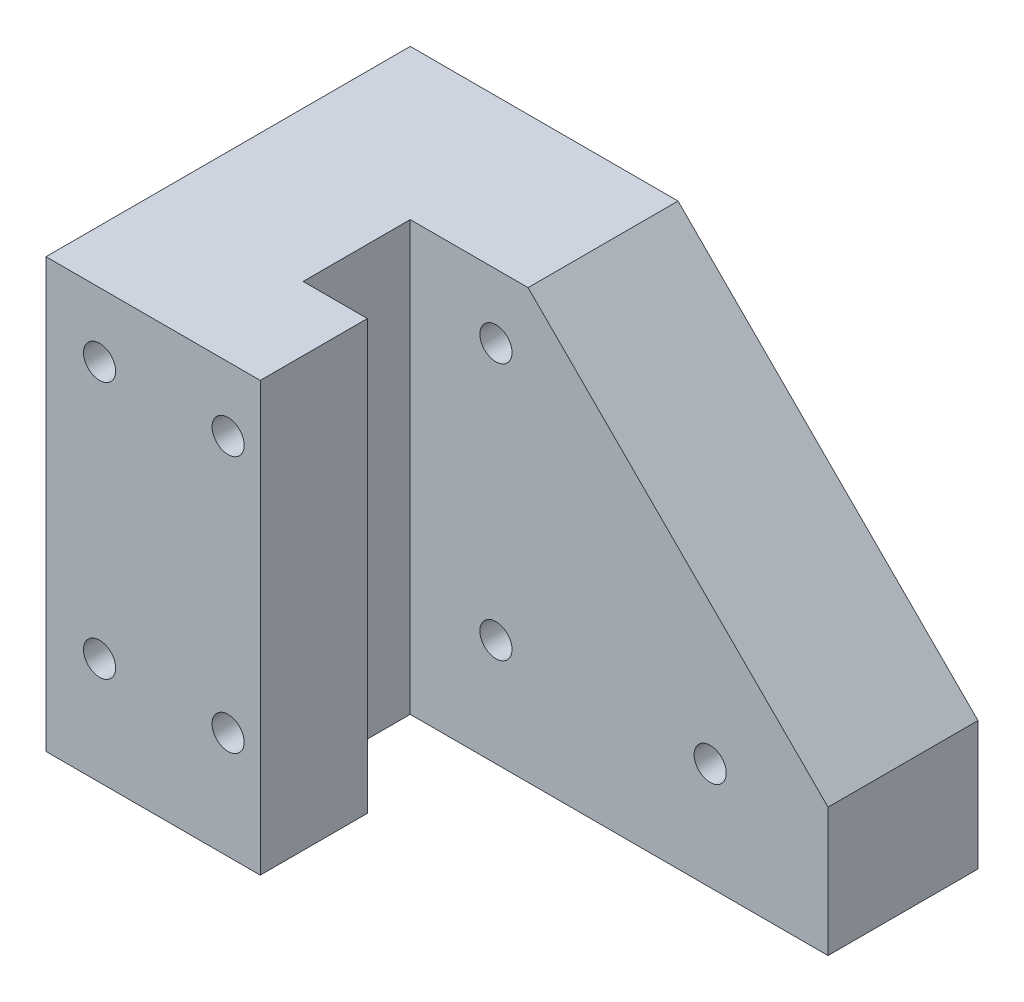
ISO-10303-21;
HEADER;
FILE_DESCRIPTION(('STEP AP214'),'2;1');
FILE_NAME('part.step','',(''),(''),'','','');
FILE_SCHEMA(('AUTOMOTIVE_DESIGN { 1 0 10303 214 1 1 1 1 }'));
ENDSEC;
DATA;
#1=APPLICATION_CONTEXT('core data for automotive mechanical design processes');
#2=APPLICATION_PROTOCOL_DEFINITION('international standard','automotive_design',2000,#1);
#3=PRODUCT_CONTEXT('',#1,'mechanical');
#4=PRODUCT('Part','Part','',(#3));
#5=PRODUCT_RELATED_PRODUCT_CATEGORY('part','',(#4));
#6=PRODUCT_DEFINITION_FORMATION('','',#4);
#7=PRODUCT_DEFINITION_CONTEXT('part definition',#1,'design');
#8=PRODUCT_DEFINITION('design','',#6,#7);
#9=PRODUCT_DEFINITION_SHAPE('','',#8);
#10=(LENGTH_UNIT() NAMED_UNIT(*) SI_UNIT(.MILLI.,.METRE.));
#11=(NAMED_UNIT(*) PLANE_ANGLE_UNIT() SI_UNIT($,.RADIAN.));
#12=(NAMED_UNIT(*) SI_UNIT($,.STERADIAN.) SOLID_ANGLE_UNIT());
#13=UNCERTAINTY_MEASURE_WITH_UNIT(LENGTH_MEASURE(1.E-05),#10,'distance_accuracy_value','');
#14=(GEOMETRIC_REPRESENTATION_CONTEXT(3) GLOBAL_UNCERTAINTY_ASSIGNED_CONTEXT((#13)) GLOBAL_UNIT_ASSIGNED_CONTEXT((#10,
#11,#12)) REPRESENTATION_CONTEXT('',''));
#15=CARTESIAN_POINT('',(0.,0.,0.));
#16=DIRECTION('',(0.,0.,1.));
#17=DIRECTION('',(1.,0.,0.));
#18=AXIS2_PLACEMENT_3D('',#15,#16,#17);
#19=CARTESIAN_POINT('',(20.,0.,34.));
#20=DIRECTION('',(-1.,0.,0.));
#21=DIRECTION('',(0.,0.,1.));
#22=AXIS2_PLACEMENT_3D('',#19,#20,#21);
#23=PLANE('',#22);
#24=DIRECTION('',(0.,-1.,0.));
#25=VECTOR('',#24,1.);
#26=CARTESIAN_POINT('',(20.,40.,24.));
#27=LINE('',#26,#25);
#28=CARTESIAN_POINT('',(20.,40.,24.));
#29=VERTEX_POINT('',#28);
#30=CARTESIAN_POINT('',(20.,0.,24.));
#31=VERTEX_POINT('',#30);
#32=EDGE_CURVE('E120',#29,#31,#27,.T.);
#33=ORIENTED_EDGE('',*,*,#32,.F.);
#34=DIRECTION('',(0.,0.,-1.));
#35=VECTOR('',#34,1.);
#36=CARTESIAN_POINT('',(20.,40.,34.));
#37=LINE('',#36,#35);
#38=CARTESIAN_POINT('',(20.,40.,34.));
#39=VERTEX_POINT('',#38);
#40=EDGE_CURVE('E132',#39,#29,#37,.T.);
#41=ORIENTED_EDGE('',*,*,#40,.F.);
#42=DIRECTION('',(0.,1.,0.));
#43=VECTOR('',#42,1.);
#44=CARTESIAN_POINT('',(20.,0.,34.));
#45=LINE('',#44,#43);
#46=CARTESIAN_POINT('',(20.,0.,34.));
#47=VERTEX_POINT('',#46);
#48=EDGE_CURVE('E200',#47,#39,#45,.T.);
#49=ORIENTED_EDGE('',*,*,#48,.F.);
#50=DIRECTION('',(0.,0.,-1.));
#51=VECTOR('',#50,1.);
#52=CARTESIAN_POINT('',(20.,0.,34.));
#53=LINE('',#52,#51);
#54=EDGE_CURVE('E134',#47,#31,#53,.T.);
#55=ORIENTED_EDGE('',*,*,#54,.T.);
#56=EDGE_LOOP('',(#33,#41,#49,#55));
#57=FACE_BOUND('',#56,.T.);
#58=ADVANCED_FACE('F41',(#57),#23,.F.);
#59=CARTESIAN_POINT('',(0.,0.,34.));
#60=DIRECTION('',(0.,1.,0.));
#61=DIRECTION('',(0.,0.,1.));
#62=AXIS2_PLACEMENT_3D('',#59,#60,#61);
#63=PLANE('',#62);
#64=DIRECTION('',(-1.,0.,0.));
#65=VECTOR('',#64,1.);
#66=CARTESIAN_POINT('',(20.,0.,24.));
#67=LINE('',#66,#65);
#68=CARTESIAN_POINT('',(14.,0.,24.));
#69=VERTEX_POINT('',#68);
#70=EDGE_CURVE('E385',#31,#69,#67,.T.);
#71=ORIENTED_EDGE('',*,*,#70,.F.);
#72=ORIENTED_EDGE('',*,*,#54,.F.);
#73=DIRECTION('',(1.,0.,0.));
#74=VECTOR('',#73,1.);
#75=CARTESIAN_POINT('',(0.,0.,34.));
#76=LINE('',#75,#74);
#77=CARTESIAN_POINT('',(0.,0.,34.));
#78=VERTEX_POINT('',#77);
#79=EDGE_CURVE('E191',#78,#47,#76,.T.);
#80=ORIENTED_EDGE('',*,*,#79,.F.);
#81=DIRECTION('',(0.,0.,-1.));
#82=VECTOR('',#81,1.);
#83=CARTESIAN_POINT('',(0.,0.,34.));
#84=LINE('',#83,#82);
#85=CARTESIAN_POINT('',(0.,0.,0.));
#86=VERTEX_POINT('',#85);
#87=EDGE_CURVE('E49',#78,#86,#84,.T.);
#88=ORIENTED_EDGE('',*,*,#87,.T.);
#89=DIRECTION('',(1.,0.,0.));
#90=VECTOR('',#89,1.);
#91=CARTESIAN_POINT('',(0.,0.,0.));
#92=LINE('',#91,#90);
#93=CARTESIAN_POINT('',(53.,0.,0.));
#94=VERTEX_POINT('',#93);
#95=EDGE_CURVE('E205',#86,#94,#92,.T.);
#96=ORIENTED_EDGE('',*,*,#95,.T.);
#97=DIRECTION('',(0.,0.,-1.));
#98=VECTOR('',#97,1.);
#99=CARTESIAN_POINT('',(53.,0.,14.));
#100=LINE('',#99,#98);
#101=CARTESIAN_POINT('',(53.,0.,14.));
#102=VERTEX_POINT('',#101);
#103=EDGE_CURVE('E172',#102,#94,#100,.T.);
#104=ORIENTED_EDGE('',*,*,#103,.F.);
#105=DIRECTION('',(-1.,0.,0.));
#106=VECTOR('',#105,1.);
#107=CARTESIAN_POINT('',(0.,0.,14.));
#108=LINE('',#107,#106);
#109=CARTESIAN_POINT('',(14.,0.,14.));
#110=VERTEX_POINT('',#109);
#111=EDGE_CURVE('E171',#102,#110,#108,.T.);
#112=ORIENTED_EDGE('',*,*,#111,.T.);
#113=DIRECTION('',(0.,0.,-1.));
#114=VECTOR('',#113,1.);
#115=CARTESIAN_POINT('',(14.,0.,14.));
#116=LINE('',#115,#114);
#117=EDGE_CURVE('E123',#69,#110,#116,.T.);
#118=ORIENTED_EDGE('',*,*,#117,.F.);
#119=EDGE_LOOP('',(#71,#72,#80,#88,#96,#104,#112,#118));
#120=FACE_BOUND('',#119,.T.);
#121=ADVANCED_FACE('F213',(#120),#63,.F.);
#122=CARTESIAN_POINT('',(0.,0.,34.));
#123=DIRECTION('',(1.,0.,0.));
#124=DIRECTION('',(0.,0.,-1.));
#125=AXIS2_PLACEMENT_3D('',#122,#123,#124);
#126=PLANE('',#125);
#127=DIRECTION('',(0.,-1.,0.));
#128=VECTOR('',#127,1.);
#129=CARTESIAN_POINT('',(0.,0.,0.));
#130=LINE('',#129,#128);
#131=CARTESIAN_POINT('',(0.,40.,0.));
#132=VERTEX_POINT('',#131);
#133=EDGE_CURVE('E185',#132,#86,#130,.T.);
#134=ORIENTED_EDGE('',*,*,#133,.T.);
#135=ORIENTED_EDGE('',*,*,#87,.F.);
#136=DIRECTION('',(0.,-1.,0.));
#137=VECTOR('',#136,1.);
#138=CARTESIAN_POINT('',(0.,0.,34.));
#139=LINE('',#138,#137);
#140=CARTESIAN_POINT('',(0.,40.,34.));
#141=VERTEX_POINT('',#140);
#142=EDGE_CURVE('E192',#141,#78,#139,.T.);
#143=ORIENTED_EDGE('',*,*,#142,.F.);
#144=DIRECTION('',(0.,0.,-1.));
#145=VECTOR('',#144,1.);
#146=CARTESIAN_POINT('',(0.,40.,34.));
#147=LINE('',#146,#145);
#148=EDGE_CURVE('E139',#141,#132,#147,.T.);
#149=ORIENTED_EDGE('',*,*,#148,.T.);
#150=EDGE_LOOP('',(#134,#135,#143,#149));
#151=FACE_BOUND('',#150,.T.);
#152=ADVANCED_FACE('F43',(#151),#126,.F.);
#153=CARTESIAN_POINT('',(0.,40.,34.));
#154=DIRECTION('',(0.,-1.,0.));
#155=DIRECTION('',(0.,0.,-1.));
#156=AXIS2_PLACEMENT_3D('',#153,#154,#155);
#157=PLANE('',#156);
#158=DIRECTION('',(0.,0.,-1.));
#159=VECTOR('',#158,1.);
#160=CARTESIAN_POINT('',(14.,40.,14.));
#161=LINE('',#160,#159);
#162=CARTESIAN_POINT('',(14.,40.,24.));
#163=VERTEX_POINT('',#162);
#164=CARTESIAN_POINT('',(14.,40.,14.));
#165=VERTEX_POINT('',#164);
#166=EDGE_CURVE('E121',#163,#165,#161,.T.);
#167=ORIENTED_EDGE('',*,*,#166,.T.);
#168=DIRECTION('',(1.,0.,0.));
#169=VECTOR('',#168,1.);
#170=CARTESIAN_POINT('',(0.,40.,14.));
#171=LINE('',#170,#169);
#172=CARTESIAN_POINT('',(25.,40.,14.));
#173=VERTEX_POINT('',#172);
#174=EDGE_CURVE('E60',#165,#173,#171,.T.);
#175=ORIENTED_EDGE('',*,*,#174,.T.);
#176=DIRECTION('',(0.,0.,-1.));
#177=VECTOR('',#176,1.);
#178=CARTESIAN_POINT('',(25.,40.,34.));
#179=LINE('',#178,#177);
#180=CARTESIAN_POINT('',(25.,40.,0.));
#181=VERTEX_POINT('',#180);
#182=EDGE_CURVE('E63',#173,#181,#179,.T.);
#183=ORIENTED_EDGE('',*,*,#182,.T.);
#184=DIRECTION('',(-1.,0.,0.));
#185=VECTOR('',#184,1.);
#186=CARTESIAN_POINT('',(0.,40.,0.));
#187=LINE('',#186,#185);
#188=EDGE_CURVE('E193',#181,#132,#187,.T.);
#189=ORIENTED_EDGE('',*,*,#188,.T.);
#190=ORIENTED_EDGE('',*,*,#148,.F.);
#191=DIRECTION('',(-1.,0.,0.));
#192=VECTOR('',#191,1.);
#193=CARTESIAN_POINT('',(0.,40.,34.));
#194=LINE('',#193,#192);
#195=EDGE_CURVE('E138',#39,#141,#194,.T.);
#196=ORIENTED_EDGE('',*,*,#195,.F.);
#197=ORIENTED_EDGE('',*,*,#40,.T.);
#198=DIRECTION('',(-1.,0.,0.));
#199=VECTOR('',#198,1.);
#200=CARTESIAN_POINT('',(20.,40.,24.));
#201=LINE('',#200,#199);
#202=EDGE_CURVE('E113',#29,#163,#201,.T.);
#203=ORIENTED_EDGE('',*,*,#202,.T.);
#204=EDGE_LOOP('',(#167,#175,#183,#189,#190,#196,#197,#203));
#205=FACE_BOUND('',#204,.T.);
#206=ADVANCED_FACE('F137',(#205),#157,.F.);
#207=CARTESIAN_POINT('',(0.,0.,34.));
#208=DIRECTION('',(0.,0.,-1.));
#209=DIRECTION('',(-1.,0.,0.));
#210=AXIS2_PLACEMENT_3D('',#207,#208,#209);
#211=PLANE('',#210);
#212=CARTESIAN_POINT('',(17.,34.,34.));
#213=DIRECTION('',(0.,0.,1.));
#214=DIRECTION('',(1.,0.,0.));
#215=AXIS2_PLACEMENT_3D('',#212,#213,#214);
#216=CIRCLE('',#215,1.5);
#217=CARTESIAN_POINT('',(18.5,34.,34.));
#218=VERTEX_POINT('',#217);
#219=EDGE_CURVE('E378',#218,#218,#216,.T.);
#220=ORIENTED_EDGE('',*,*,#219,.F.);
#221=EDGE_LOOP('',(#220));
#222=FACE_BOUND('',#221,.T.);
#223=CARTESIAN_POINT('',(17.,10.,34.));
#224=DIRECTION('',(0.,0.,1.));
#225=DIRECTION('',(1.,0.,0.));
#226=AXIS2_PLACEMENT_3D('',#223,#224,#225);
#227=CIRCLE('',#226,1.5);
#228=CARTESIAN_POINT('',(18.5,10.,34.));
#229=VERTEX_POINT('',#228);
#230=EDGE_CURVE('E379',#229,#229,#227,.T.);
#231=ORIENTED_EDGE('',*,*,#230,.F.);
#232=EDGE_LOOP('',(#231));
#233=FACE_BOUND('',#232,.T.);
#234=CARTESIAN_POINT('',(5.,34.,34.));
#235=DIRECTION('',(0.,0.,1.));
#236=DIRECTION('',(1.,0.,0.));
#237=AXIS2_PLACEMENT_3D('',#234,#235,#236);
#238=CIRCLE('',#237,1.5);
#239=CARTESIAN_POINT('',(6.5,34.,34.));
#240=VERTEX_POINT('',#239);
#241=EDGE_CURVE('E182',#240,#240,#238,.T.);
#242=ORIENTED_EDGE('',*,*,#241,.F.);
#243=EDGE_LOOP('',(#242));
#244=FACE_BOUND('',#243,.T.);
#245=CARTESIAN_POINT('',(5.,10.,34.));
#246=DIRECTION('',(0.,0.,1.));
#247=DIRECTION('',(1.,0.,0.));
#248=AXIS2_PLACEMENT_3D('',#245,#246,#247);
#249=CIRCLE('',#248,1.5);
#250=CARTESIAN_POINT('',(6.5,10.,34.));
#251=VERTEX_POINT('',#250);
#252=EDGE_CURVE('E187',#251,#251,#249,.T.);
#253=ORIENTED_EDGE('',*,*,#252,.F.);
#254=EDGE_LOOP('',(#253));
#255=FACE_BOUND('',#254,.T.);
#256=ORIENTED_EDGE('',*,*,#142,.T.);
#257=ORIENTED_EDGE('',*,*,#79,.T.);
#258=ORIENTED_EDGE('',*,*,#48,.T.);
#259=ORIENTED_EDGE('',*,*,#195,.T.);
#260=EDGE_LOOP('',(#256,#257,#258,#259));
#261=FACE_BOUND('',#260,.T.);
#262=ADVANCED_FACE('F220',(#222,#233,#244,#255,#261),#211,.F.);
#263=CARTESIAN_POINT('',(0.,0.,0.));
#264=DIRECTION('',(0.,0.,-1.));
#265=DIRECTION('',(-1.,0.,0.));
#266=AXIS2_PLACEMENT_3D('',#263,#264,#265);
#267=PLANE('',#266);
#268=CARTESIAN_POINT('',(22.,34.,0.));
#269=DIRECTION('',(0.,0.,-1.));
#270=DIRECTION('',(-1.,0.,0.));
#271=AXIS2_PLACEMENT_3D('',#268,#269,#270);
#272=CIRCLE('',#271,1.5);
#273=CARTESIAN_POINT('',(20.5,34.,0.));
#274=VERTEX_POINT('',#273);
#275=EDGE_CURVE('E152',#274,#274,#272,.T.);
#276=ORIENTED_EDGE('',*,*,#275,.F.);
#277=EDGE_LOOP('',(#276));
#278=FACE_BOUND('',#277,.T.);
#279=CARTESIAN_POINT('',(22.,10.,0.));
#280=DIRECTION('',(0.,0.,-1.));
#281=DIRECTION('',(-1.,0.,0.));
#282=AXIS2_PLACEMENT_3D('',#279,#280,#281);
#283=CIRCLE('',#282,1.5);
#284=CARTESIAN_POINT('',(20.5,10.,0.));
#285=VERTEX_POINT('',#284);
#286=EDGE_CURVE('E398',#285,#285,#283,.T.);
#287=ORIENTED_EDGE('',*,*,#286,.F.);
#288=EDGE_LOOP('',(#287));
#289=FACE_BOUND('',#288,.T.);
#290=CARTESIAN_POINT('',(42.,10.,0.));
#291=DIRECTION('',(0.,0.,-1.));
#292=DIRECTION('',(-1.,0.,0.));
#293=AXIS2_PLACEMENT_3D('',#290,#291,#292);
#294=CIRCLE('',#293,1.5);
#295=CARTESIAN_POINT('',(40.5,10.,0.));
#296=VERTEX_POINT('',#295);
#297=EDGE_CURVE('E164',#296,#296,#294,.T.);
#298=ORIENTED_EDGE('',*,*,#297,.F.);
#299=EDGE_LOOP('',(#298));
#300=FACE_BOUND('',#299,.T.);
#301=DIRECTION('',(-0.707106781186547,0.707106781186547,0.));
#302=VECTOR('',#301,1.);
#303=CARTESIAN_POINT('',(53.,12.,0.));
#304=LINE('',#303,#302);
#305=CARTESIAN_POINT('',(53.,12.,0.));
#306=VERTEX_POINT('',#305);
#307=EDGE_CURVE('E157',#306,#181,#304,.T.);
#308=ORIENTED_EDGE('',*,*,#307,.F.);
#309=DIRECTION('',(0.,-1.,0.));
#310=VECTOR('',#309,1.);
#311=CARTESIAN_POINT('',(53.,0.,0.));
#312=LINE('',#311,#310);
#313=EDGE_CURVE('E170',#306,#94,#312,.T.);
#314=ORIENTED_EDGE('',*,*,#313,.T.);
#315=ORIENTED_EDGE('',*,*,#95,.F.);
#316=ORIENTED_EDGE('',*,*,#133,.F.);
#317=ORIENTED_EDGE('',*,*,#188,.F.);
#318=EDGE_LOOP('',(#308,#314,#315,#316,#317));
#319=FACE_BOUND('',#318,.T.);
#320=CARTESIAN_POINT('',(5.,34.,0.));
#321=DIRECTION('',(0.,0.,1.));
#322=DIRECTION('',(1.,0.,0.));
#323=AXIS2_PLACEMENT_3D('',#320,#321,#322);
#324=CIRCLE('',#323,1.5);
#325=CARTESIAN_POINT('',(6.5,34.,0.));
#326=VERTEX_POINT('',#325);
#327=EDGE_CURVE('E177',#326,#326,#324,.T.);
#328=ORIENTED_EDGE('',*,*,#327,.T.);
#329=EDGE_LOOP('',(#328));
#330=FACE_BOUND('',#329,.T.);
#331=CARTESIAN_POINT('',(5.,10.,0.));
#332=DIRECTION('',(0.,0.,1.));
#333=DIRECTION('',(1.,0.,0.));
#334=AXIS2_PLACEMENT_3D('',#331,#332,#333);
#335=CIRCLE('',#334,1.5);
#336=CARTESIAN_POINT('',(6.5,10.,0.));
#337=VERTEX_POINT('',#336);
#338=EDGE_CURVE('E178',#337,#337,#335,.T.);
#339=ORIENTED_EDGE('',*,*,#338,.T.);
#340=EDGE_LOOP('',(#339));
#341=FACE_BOUND('',#340,.T.);
#342=ADVANCED_FACE('F208',(#278,#289,#300,#319,#330,#341),#267,.T.);
#343=CARTESIAN_POINT('',(5.,10.,0.));
#344=DIRECTION('',(0.,0.,1.));
#345=DIRECTION('',(1.,0.,0.));
#346=AXIS2_PLACEMENT_3D('',#343,#344,#345);
#347=CYLINDRICAL_SURFACE('',#346,1.5);
#348=ORIENTED_EDGE('',*,*,#338,.F.);
#349=EDGE_LOOP('',(#348));
#350=FACE_BOUND('',#349,.T.);
#351=ORIENTED_EDGE('',*,*,#252,.T.);
#352=EDGE_LOOP('',(#351));
#353=FACE_BOUND('',#352,.T.);
#354=ADVANCED_FACE('F228',(#350,#353),#347,.F.);
#355=CARTESIAN_POINT('',(5.,34.,0.));
#356=DIRECTION('',(0.,0.,1.));
#357=DIRECTION('',(1.,0.,0.));
#358=AXIS2_PLACEMENT_3D('',#355,#356,#357);
#359=CYLINDRICAL_SURFACE('',#358,1.5);
#360=ORIENTED_EDGE('',*,*,#327,.F.);
#361=EDGE_LOOP('',(#360));
#362=FACE_BOUND('',#361,.T.);
#363=ORIENTED_EDGE('',*,*,#241,.T.);
#364=EDGE_LOOP('',(#363));
#365=FACE_BOUND('',#364,.T.);
#366=ADVANCED_FACE('F254',(#362,#365),#359,.F.);
#367=CARTESIAN_POINT('',(53.,0.,14.));
#368=DIRECTION('',(1.,0.,0.));
#369=DIRECTION('',(0.,0.,-1.));
#370=AXIS2_PLACEMENT_3D('',#367,#368,#369);
#371=PLANE('',#370);
#372=DIRECTION('',(0.,0.,-1.));
#373=VECTOR('',#372,1.);
#374=CARTESIAN_POINT('',(53.,12.,34.));
#375=LINE('',#374,#373);
#376=CARTESIAN_POINT('',(53.,12.,14.));
#377=VERTEX_POINT('',#376);
#378=EDGE_CURVE('E163',#377,#306,#375,.T.);
#379=ORIENTED_EDGE('',*,*,#378,.F.);
#380=DIRECTION('',(0.,-1.,0.));
#381=VECTOR('',#380,1.);
#382=CARTESIAN_POINT('',(53.,0.,14.));
#383=LINE('',#382,#381);
#384=EDGE_CURVE('E169',#377,#102,#383,.T.);
#385=ORIENTED_EDGE('',*,*,#384,.T.);
#386=ORIENTED_EDGE('',*,*,#103,.T.);
#387=ORIENTED_EDGE('',*,*,#313,.F.);
#388=EDGE_LOOP('',(#379,#385,#386,#387));
#389=FACE_BOUND('',#388,.T.);
#390=ADVANCED_FACE('F265',(#389),#371,.T.);
#391=CARTESIAN_POINT('',(0.,0.,14.));
#392=DIRECTION('',(0.,0.,-1.));
#393=DIRECTION('',(-1.,0.,0.));
#394=AXIS2_PLACEMENT_3D('',#391,#392,#393);
#395=PLANE('',#394);
#396=CARTESIAN_POINT('',(22.,34.,14.));
#397=DIRECTION('',(0.,0.,-1.));
#398=DIRECTION('',(-1.,0.,0.));
#399=AXIS2_PLACEMENT_3D('',#396,#397,#398);
#400=CIRCLE('',#399,1.5);
#401=CARTESIAN_POINT('',(20.5,34.,14.));
#402=VERTEX_POINT('',#401);
#403=EDGE_CURVE('E44',#402,#402,#400,.T.);
#404=ORIENTED_EDGE('',*,*,#403,.T.);
#405=EDGE_LOOP('',(#404));
#406=FACE_BOUND('',#405,.T.);
#407=CARTESIAN_POINT('',(22.,10.,14.));
#408=DIRECTION('',(0.,0.,-1.));
#409=DIRECTION('',(-1.,0.,0.));
#410=AXIS2_PLACEMENT_3D('',#407,#408,#409);
#411=CIRCLE('',#410,1.5);
#412=CARTESIAN_POINT('',(20.5,10.,14.));
#413=VERTEX_POINT('',#412);
#414=EDGE_CURVE('E148',#413,#413,#411,.T.);
#415=ORIENTED_EDGE('',*,*,#414,.T.);
#416=EDGE_LOOP('',(#415));
#417=FACE_BOUND('',#416,.T.);
#418=CARTESIAN_POINT('',(42.,10.,14.));
#419=DIRECTION('',(0.,0.,-1.));
#420=DIRECTION('',(-1.,0.,0.));
#421=AXIS2_PLACEMENT_3D('',#418,#419,#420);
#422=CIRCLE('',#421,1.5);
#423=CARTESIAN_POINT('',(40.5,10.,14.));
#424=VERTEX_POINT('',#423);
#425=EDGE_CURVE('E149',#424,#424,#422,.T.);
#426=ORIENTED_EDGE('',*,*,#425,.T.);
#427=EDGE_LOOP('',(#426));
#428=FACE_BOUND('',#427,.T.);
#429=ORIENTED_EDGE('',*,*,#384,.F.);
#430=DIRECTION('',(-0.707106781186548,0.707106781186548,0.));
#431=VECTOR('',#430,1.);
#432=CARTESIAN_POINT('',(32.5,32.5,14.));
#433=LINE('',#432,#431);
#434=EDGE_CURVE('E11',#377,#173,#433,.T.);
#435=ORIENTED_EDGE('',*,*,#434,.T.);
#436=ORIENTED_EDGE('',*,*,#174,.F.);
#437=DIRECTION('',(0.,-1.,0.));
#438=VECTOR('',#437,1.);
#439=CARTESIAN_POINT('',(14.,40.,14.));
#440=LINE('',#439,#438);
#441=EDGE_CURVE('E394',#165,#110,#440,.T.);
#442=ORIENTED_EDGE('',*,*,#441,.T.);
#443=ORIENTED_EDGE('',*,*,#111,.F.);
#444=EDGE_LOOP('',(#429,#435,#436,#442,#443));
#445=FACE_BOUND('',#444,.T.);
#446=ADVANCED_FACE('F275',(#406,#417,#428,#445),#395,.F.);
#447=CARTESIAN_POINT('',(53.,12.,34.));
#448=DIRECTION('',(-0.707106781186547,-0.707106781186547,0.));
#449=DIRECTION('',(0.707106781186548,-0.707106781186548,0.));
#450=AXIS2_PLACEMENT_3D('',#447,#448,#449);
#451=PLANE('',#450);
#452=ORIENTED_EDGE('',*,*,#378,.T.);
#453=ORIENTED_EDGE('',*,*,#307,.T.);
#454=ORIENTED_EDGE('',*,*,#182,.F.);
#455=ORIENTED_EDGE('',*,*,#434,.F.);
#456=EDGE_LOOP('',(#452,#453,#454,#455));
#457=FACE_BOUND('',#456,.T.);
#458=ADVANCED_FACE('F278',(#457),#451,.F.);
#459=CARTESIAN_POINT('',(42.,10.,34.));
#460=DIRECTION('',(0.,0.,-1.));
#461=DIRECTION('',(-1.,0.,0.));
#462=AXIS2_PLACEMENT_3D('',#459,#460,#461);
#463=CYLINDRICAL_SURFACE('',#462,1.5);
#464=ORIENTED_EDGE('',*,*,#297,.T.);
#465=EDGE_LOOP('',(#464));
#466=FACE_BOUND('',#465,.T.);
#467=ORIENTED_EDGE('',*,*,#425,.F.);
#468=EDGE_LOOP('',(#467));
#469=FACE_BOUND('',#468,.T.);
#470=ADVANCED_FACE('F283',(#466,#469),#463,.F.);
#471=CARTESIAN_POINT('',(22.,10.,34.));
#472=DIRECTION('',(0.,0.,-1.));
#473=DIRECTION('',(-1.,0.,0.));
#474=AXIS2_PLACEMENT_3D('',#471,#472,#473);
#475=CYLINDRICAL_SURFACE('',#474,1.5);
#476=ORIENTED_EDGE('',*,*,#286,.T.);
#477=EDGE_LOOP('',(#476));
#478=FACE_BOUND('',#477,.T.);
#479=ORIENTED_EDGE('',*,*,#414,.F.);
#480=EDGE_LOOP('',(#479));
#481=FACE_BOUND('',#480,.T.);
#482=ADVANCED_FACE('F294',(#478,#481),#475,.F.);
#483=CARTESIAN_POINT('',(22.,34.,34.));
#484=DIRECTION('',(0.,0.,-1.));
#485=DIRECTION('',(-1.,0.,0.));
#486=AXIS2_PLACEMENT_3D('',#483,#484,#485);
#487=CYLINDRICAL_SURFACE('',#486,1.5);
#488=ORIENTED_EDGE('',*,*,#275,.T.);
#489=EDGE_LOOP('',(#488));
#490=FACE_BOUND('',#489,.T.);
#491=ORIENTED_EDGE('',*,*,#403,.F.);
#492=EDGE_LOOP('',(#491));
#493=FACE_BOUND('',#492,.T.);
#494=ADVANCED_FACE('F303',(#490,#493),#487,.F.);
#495=CARTESIAN_POINT('',(14.,40.,14.));
#496=DIRECTION('',(-1.,0.,0.));
#497=DIRECTION('',(0.,0.,1.));
#498=AXIS2_PLACEMENT_3D('',#495,#496,#497);
#499=PLANE('',#498);
#500=ORIENTED_EDGE('',*,*,#117,.T.);
#501=ORIENTED_EDGE('',*,*,#441,.F.);
#502=ORIENTED_EDGE('',*,*,#166,.F.);
#503=DIRECTION('',(0.,-1.,0.));
#504=VECTOR('',#503,1.);
#505=CARTESIAN_POINT('',(14.,40.,24.));
#506=LINE('',#505,#504);
#507=EDGE_CURVE('E118',#163,#69,#506,.T.);
#508=ORIENTED_EDGE('',*,*,#507,.T.);
#509=EDGE_LOOP('',(#500,#501,#502,#508));
#510=FACE_BOUND('',#509,.T.);
#511=ADVANCED_FACE('F311',(#510),#499,.F.);
#512=CARTESIAN_POINT('',(20.,40.,24.));
#513=DIRECTION('',(0.,0.,1.));
#514=DIRECTION('',(1.,0.,0.));
#515=AXIS2_PLACEMENT_3D('',#512,#513,#514);
#516=PLANE('',#515);
#517=CARTESIAN_POINT('',(17.,34.,24.));
#518=DIRECTION('',(0.,0.,1.));
#519=DIRECTION('',(1.,0.,0.));
#520=AXIS2_PLACEMENT_3D('',#517,#518,#519);
#521=CIRCLE('',#520,1.5);
#522=CARTESIAN_POINT('',(18.5,34.,24.));
#523=VERTEX_POINT('',#522);
#524=EDGE_CURVE('E380',#523,#523,#521,.F.);
#525=ORIENTED_EDGE('',*,*,#524,.F.);
#526=EDGE_LOOP('',(#525));
#527=FACE_BOUND('',#526,.T.);
#528=CARTESIAN_POINT('',(17.,10.,24.));
#529=DIRECTION('',(0.,0.,1.));
#530=DIRECTION('',(1.,0.,0.));
#531=AXIS2_PLACEMENT_3D('',#528,#529,#530);
#532=CIRCLE('',#531,1.5);
#533=CARTESIAN_POINT('',(18.5,10.,24.));
#534=VERTEX_POINT('',#533);
#535=EDGE_CURVE('E383',#534,#534,#532,.F.);
#536=ORIENTED_EDGE('',*,*,#535,.F.);
#537=EDGE_LOOP('',(#536));
#538=FACE_BOUND('',#537,.T.);
#539=ORIENTED_EDGE('',*,*,#70,.T.);
#540=ORIENTED_EDGE('',*,*,#507,.F.);
#541=ORIENTED_EDGE('',*,*,#202,.F.);
#542=ORIENTED_EDGE('',*,*,#32,.T.);
#543=EDGE_LOOP('',(#539,#540,#541,#542));
#544=FACE_BOUND('',#543,.T.);
#545=ADVANCED_FACE('F116',(#527,#538,#544),#516,.F.);
#546=CARTESIAN_POINT('',(17.,10.,19.7573593128807));
#547=DIRECTION('',(0.,0.,1.));
#548=DIRECTION('',(1.,0.,0.));
#549=AXIS2_PLACEMENT_3D('',#546,#547,#548);
#550=CYLINDRICAL_SURFACE('',#549,1.5);
#551=CARTESIAN_POINT('',(18.5,10.,24.));
#552=CARTESIAN_POINT('',(18.5,10.,24.1041666666667));
#553=CARTESIAN_POINT('',(18.5,10.,24.2083333333333));
#554=CARTESIAN_POINT('',(18.5,10.,24.4166666666667));
#555=CARTESIAN_POINT('',(18.5,10.,24.5208333333333));
#556=CARTESIAN_POINT('',(18.5,10.,24.7291666666667));
#557=CARTESIAN_POINT('',(18.5,10.,24.8333333333333));
#558=CARTESIAN_POINT('',(18.5,10.,25.0416666666667));
#559=CARTESIAN_POINT('',(18.5,10.,25.1458333333333));
#560=CARTESIAN_POINT('',(18.5,10.,25.3541666666667));
#561=CARTESIAN_POINT('',(18.5,10.,25.4583333333333));
#562=CARTESIAN_POINT('',(18.5,10.,25.6666666666667));
#563=CARTESIAN_POINT('',(18.5,10.,25.7708333333333));
#564=CARTESIAN_POINT('',(18.5,10.,25.9791666666667));
#565=CARTESIAN_POINT('',(18.5,10.,26.0833333333333));
#566=CARTESIAN_POINT('',(18.5,10.,26.2916666666667));
#567=CARTESIAN_POINT('',(18.5,10.,26.3958333333333));
#568=CARTESIAN_POINT('',(18.5,10.,26.6041666666667));
#569=CARTESIAN_POINT('',(18.5,10.,26.7083333333333));
#570=CARTESIAN_POINT('',(18.5,10.,26.9166666666667));
#571=CARTESIAN_POINT('',(18.5,10.,27.0208333333333));
#572=CARTESIAN_POINT('',(18.5,10.,27.2291666666667));
#573=CARTESIAN_POINT('',(18.5,10.,27.3333333333333));
#574=CARTESIAN_POINT('',(18.5,10.,27.5416666666667));
#575=CARTESIAN_POINT('',(18.5,10.,27.6458333333333));
#576=CARTESIAN_POINT('',(18.5,10.,27.8541666666667));
#577=CARTESIAN_POINT('',(18.5,10.,27.9583333333333));
#578=CARTESIAN_POINT('',(18.5,10.,28.1666666666667));
#579=CARTESIAN_POINT('',(18.5,10.,28.2708333333333));
#580=CARTESIAN_POINT('',(18.5,10.,28.4791666666667));
#581=CARTESIAN_POINT('',(18.5,10.,28.5833333333333));
#582=CARTESIAN_POINT('',(18.5,10.,28.7916666666667));
#583=CARTESIAN_POINT('',(18.5,10.,28.8958333333333));
#584=CARTESIAN_POINT('',(18.5,10.,29.1041666666667));
#585=CARTESIAN_POINT('',(18.5,10.,29.2083333333333));
#586=CARTESIAN_POINT('',(18.5,10.,29.4166666666667));
#587=CARTESIAN_POINT('',(18.5,10.,29.5208333333333));
#588=CARTESIAN_POINT('',(18.5,10.,29.7291666666667));
#589=CARTESIAN_POINT('',(18.5,10.,29.8333333333333));
#590=CARTESIAN_POINT('',(18.5,10.,30.0416666666667));
#591=CARTESIAN_POINT('',(18.5,10.,30.1458333333333));
#592=CARTESIAN_POINT('',(18.5,10.,30.3541666666667));
#593=CARTESIAN_POINT('',(18.5,10.,30.4583333333333));
#594=CARTESIAN_POINT('',(18.5,10.,30.6666666666667));
#595=CARTESIAN_POINT('',(18.5,10.,30.7708333333333));
#596=CARTESIAN_POINT('',(18.5,10.,30.9791666666667));
#597=CARTESIAN_POINT('',(18.5,10.,31.0833333333333));
#598=CARTESIAN_POINT('',(18.5,10.,31.2916666666667));
#599=CARTESIAN_POINT('',(18.5,10.,31.3958333333333));
#600=CARTESIAN_POINT('',(18.5,10.,31.6041666666667));
#601=CARTESIAN_POINT('',(18.5,10.,31.7083333333333));
#602=CARTESIAN_POINT('',(18.5,10.,31.9166666666667));
#603=CARTESIAN_POINT('',(18.5,10.,32.0208333333333));
#604=CARTESIAN_POINT('',(18.5,10.,32.2291666666667));
#605=CARTESIAN_POINT('',(18.5,10.,32.3333333333333));
#606=CARTESIAN_POINT('',(18.5,10.,32.5416666666667));
#607=CARTESIAN_POINT('',(18.5,10.,32.6458333333333));
#608=CARTESIAN_POINT('',(18.5,10.,32.8541666666667));
#609=CARTESIAN_POINT('',(18.5,10.,32.9583333333333));
#610=CARTESIAN_POINT('',(18.5,10.,33.1666666666667));
#611=CARTESIAN_POINT('',(18.5,10.,33.2708333333333));
#612=CARTESIAN_POINT('',(18.5,10.,33.4791666666667));
#613=CARTESIAN_POINT('',(18.5,10.,33.5833333333333));
#614=CARTESIAN_POINT('',(18.5,10.,33.7916666666667));
#615=CARTESIAN_POINT('',(18.5,10.,33.8958333333333));
#616=CARTESIAN_POINT('',(18.5,10.,34.));
#617=B_SPLINE_CURVE_WITH_KNOTS('',3,(#551,#552,#553,#554,#555,#556,#557,#558,#559,#560,#561,
#562,#563,#564,#565,#566,#567,#568,#569,#570,#571,#572,#573,#574,#575,#576,#577,#578,#579,#580,
#581,#582,#583,#584,#585,#586,#587,#588,#589,#590,#591,#592,#593,#594,#595,#596,#597,#598,#599,
#600,#601,#602,#603,#604,#605,#606,#607,#608,#609,#610,#611,#612,#613,#614,#615,#616),
.UNSPECIFIED.,.F.,.F.,(4,2,2,2,2,2,2,2,2,2,2,2,2,2,2,2,2,2,2,2,2,2,2,2,2,2,2,2,2,2,2,2,4),(0.,
0.3125,0.625000000000001,0.937500000000001,1.25,1.5625,1.875,2.1875,2.5,2.8125,3.125,3.4375,
3.75,4.0625,4.375,4.6875,5.,5.3125,5.625,5.9375,6.25,6.5625,6.875,7.1875,7.5,7.8125,8.125,
8.4375,8.75,9.0625,9.375,9.6875,10.),.UNSPECIFIED.);
#618=EDGE_CURVE('BSEAM352',#534,#229,#617,.T.);
#619=ORIENTED_EDGE('',*,*,#535,.T.);
#620=ORIENTED_EDGE('',*,*,#230,.T.);
#621=ORIENTED_EDGE('',*,*,#618,.T.);
#622=ORIENTED_EDGE('',*,*,#618,.F.);
#623=EDGE_LOOP('',(#619,#621,#620,#622));
#624=FACE_BOUND('',#623,.T.);
#625=ADVANCED_FACE('F352',(#624),#550,.F.);
#626=CARTESIAN_POINT('',(17.,34.,19.7573593128807));
#627=DIRECTION('',(0.,0.,1.));
#628=DIRECTION('',(1.,0.,0.));
#629=AXIS2_PLACEMENT_3D('',#626,#627,#628);
#630=CYLINDRICAL_SURFACE('',#629,1.5);
#631=CARTESIAN_POINT('',(18.5,34.,24.));
#632=CARTESIAN_POINT('',(18.5,34.,24.1041666666667));
#633=CARTESIAN_POINT('',(18.5,34.,24.2083333333333));
#634=CARTESIAN_POINT('',(18.5,34.,24.4166666666667));
#635=CARTESIAN_POINT('',(18.5,34.,24.5208333333333));
#636=CARTESIAN_POINT('',(18.5,34.,24.7291666666667));
#637=CARTESIAN_POINT('',(18.5,34.,24.8333333333333));
#638=CARTESIAN_POINT('',(18.5,34.,25.0416666666667));
#639=CARTESIAN_POINT('',(18.5,34.,25.1458333333333));
#640=CARTESIAN_POINT('',(18.5,34.,25.3541666666667));
#641=CARTESIAN_POINT('',(18.5,34.,25.4583333333333));
#642=CARTESIAN_POINT('',(18.5,34.,25.6666666666667));
#643=CARTESIAN_POINT('',(18.5,34.,25.7708333333333));
#644=CARTESIAN_POINT('',(18.5,34.,25.9791666666667));
#645=CARTESIAN_POINT('',(18.5,34.,26.0833333333333));
#646=CARTESIAN_POINT('',(18.5,34.,26.2916666666667));
#647=CARTESIAN_POINT('',(18.5,34.,26.3958333333333));
#648=CARTESIAN_POINT('',(18.5,34.,26.6041666666667));
#649=CARTESIAN_POINT('',(18.5,34.,26.7083333333333));
#650=CARTESIAN_POINT('',(18.5,34.,26.9166666666667));
#651=CARTESIAN_POINT('',(18.5,34.,27.0208333333333));
#652=CARTESIAN_POINT('',(18.5,34.,27.2291666666667));
#653=CARTESIAN_POINT('',(18.5,34.,27.3333333333333));
#654=CARTESIAN_POINT('',(18.5,34.,27.5416666666667));
#655=CARTESIAN_POINT('',(18.5,34.,27.6458333333333));
#656=CARTESIAN_POINT('',(18.5,34.,27.8541666666667));
#657=CARTESIAN_POINT('',(18.5,34.,27.9583333333333));
#658=CARTESIAN_POINT('',(18.5,34.,28.1666666666667));
#659=CARTESIAN_POINT('',(18.5,34.,28.2708333333333));
#660=CARTESIAN_POINT('',(18.5,34.,28.4791666666667));
#661=CARTESIAN_POINT('',(18.5,34.,28.5833333333333));
#662=CARTESIAN_POINT('',(18.5,34.,28.7916666666667));
#663=CARTESIAN_POINT('',(18.5,34.,28.8958333333333));
#664=CARTESIAN_POINT('',(18.5,34.,29.1041666666667));
#665=CARTESIAN_POINT('',(18.5,34.,29.2083333333333));
#666=CARTESIAN_POINT('',(18.5,34.,29.4166666666667));
#667=CARTESIAN_POINT('',(18.5,34.,29.5208333333333));
#668=CARTESIAN_POINT('',(18.5,34.,29.7291666666667));
#669=CARTESIAN_POINT('',(18.5,34.,29.8333333333333));
#670=CARTESIAN_POINT('',(18.5,34.,30.0416666666667));
#671=CARTESIAN_POINT('',(18.5,34.,30.1458333333333));
#672=CARTESIAN_POINT('',(18.5,34.,30.3541666666667));
#673=CARTESIAN_POINT('',(18.5,34.,30.4583333333333));
#674=CARTESIAN_POINT('',(18.5,34.,30.6666666666667));
#675=CARTESIAN_POINT('',(18.5,34.,30.7708333333333));
#676=CARTESIAN_POINT('',(18.5,34.,30.9791666666667));
#677=CARTESIAN_POINT('',(18.5,34.,31.0833333333333));
#678=CARTESIAN_POINT('',(18.5,34.,31.2916666666667));
#679=CARTESIAN_POINT('',(18.5,34.,31.3958333333333));
#680=CARTESIAN_POINT('',(18.5,34.,31.6041666666667));
#681=CARTESIAN_POINT('',(18.5,34.,31.7083333333333));
#682=CARTESIAN_POINT('',(18.5,34.,31.9166666666667));
#683=CARTESIAN_POINT('',(18.5,34.,32.0208333333333));
#684=CARTESIAN_POINT('',(18.5,34.,32.2291666666667));
#685=CARTESIAN_POINT('',(18.5,34.,32.3333333333333));
#686=CARTESIAN_POINT('',(18.5,34.,32.5416666666667));
#687=CARTESIAN_POINT('',(18.5,34.,32.6458333333333));
#688=CARTESIAN_POINT('',(18.5,34.,32.8541666666667));
#689=CARTESIAN_POINT('',(18.5,34.,32.9583333333333));
#690=CARTESIAN_POINT('',(18.5,34.,33.1666666666667));
#691=CARTESIAN_POINT('',(18.5,34.,33.2708333333333));
#692=CARTESIAN_POINT('',(18.5,34.,33.4791666666667));
#693=CARTESIAN_POINT('',(18.5,34.,33.5833333333333));
#694=CARTESIAN_POINT('',(18.5,34.,33.7916666666667));
#695=CARTESIAN_POINT('',(18.5,34.,33.8958333333333));
#696=CARTESIAN_POINT('',(18.5,34.,34.));
#697=B_SPLINE_CURVE_WITH_KNOTS('',3,(#631,#632,#633,#634,#635,#636,#637,#638,#639,#640,#641,
#642,#643,#644,#645,#646,#647,#648,#649,#650,#651,#652,#653,#654,#655,#656,#657,#658,#659,#660,
#661,#662,#663,#664,#665,#666,#667,#668,#669,#670,#671,#672,#673,#674,#675,#676,#677,#678,#679,
#680,#681,#682,#683,#684,#685,#686,#687,#688,#689,#690,#691,#692,#693,#694,#695,#696),
.UNSPECIFIED.,.F.,.F.,(4,2,2,2,2,2,2,2,2,2,2,2,2,2,2,2,2,2,2,2,2,2,2,2,2,2,2,2,2,2,2,2,4),(0.,
0.3125,0.625000000000001,0.937500000000001,1.25,1.5625,1.875,2.1875,2.5,2.8125,3.125,3.4375,
3.75,4.0625,4.375,4.6875,5.,5.3125,5.625,5.9375,6.25,6.5625,6.875,7.1875,7.5,7.8125,8.125,
8.4375,8.75,9.0625,9.375,9.6875,10.),.UNSPECIFIED.);
#698=EDGE_CURVE('BSEAM363',#523,#218,#697,.T.);
#699=ORIENTED_EDGE('',*,*,#524,.T.);
#700=ORIENTED_EDGE('',*,*,#219,.T.);
#701=ORIENTED_EDGE('',*,*,#698,.T.);
#702=ORIENTED_EDGE('',*,*,#698,.F.);
#703=EDGE_LOOP('',(#699,#701,#700,#702));
#704=FACE_BOUND('',#703,.T.);
#705=ADVANCED_FACE('F363',(#704),#630,.F.);
#706=CLOSED_SHELL('',(#58,#121,#152,#206,#262,#342,#354,#366,#390,#446,#458,#470,#482,#494,#511,
#545,#625,#705));
#707=MANIFOLD_SOLID_BREP('B2',#706);
#708=ADVANCED_BREP_SHAPE_REPRESENTATION('',(#18,#707),#14);
#709=SHAPE_DEFINITION_REPRESENTATION(#9,#708);
ENDSEC;
END-ISO-10303-21;
